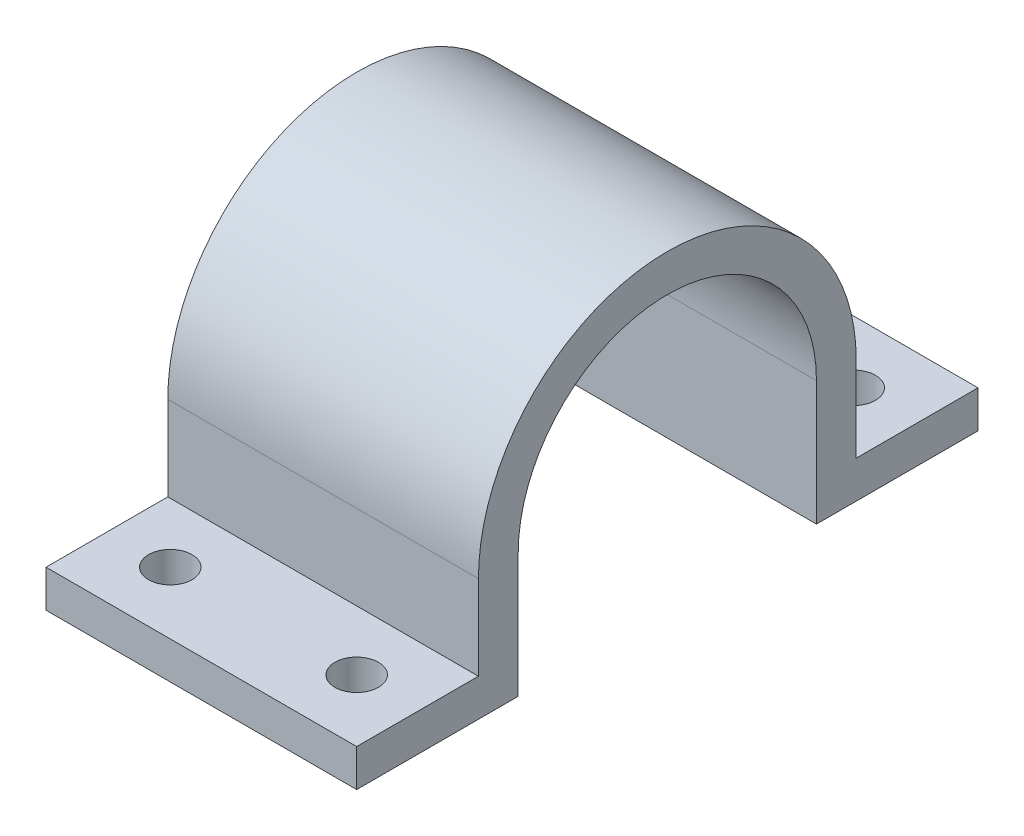
ISO-10303-21;
HEADER;
FILE_DESCRIPTION(('STEP AP214'),'2;1');
FILE_NAME('part.step','',(''),(''),'','','');
FILE_SCHEMA(('AUTOMOTIVE_DESIGN { 1 0 10303 214 1 1 1 1 }'));
ENDSEC;
DATA;
#1=APPLICATION_CONTEXT('core data for automotive mechanical design processes');
#2=APPLICATION_PROTOCOL_DEFINITION('international standard','automotive_design',2000,#1);
#3=PRODUCT_CONTEXT('',#1,'mechanical');
#4=PRODUCT('Part','Part','',(#3));
#5=PRODUCT_RELATED_PRODUCT_CATEGORY('part','',(#4));
#6=PRODUCT_DEFINITION_FORMATION('','',#4);
#7=PRODUCT_DEFINITION_CONTEXT('part definition',#1,'design');
#8=PRODUCT_DEFINITION('design','',#6,#7);
#9=PRODUCT_DEFINITION_SHAPE('','',#8);
#10=(LENGTH_UNIT() NAMED_UNIT(*) SI_UNIT(.MILLI.,.METRE.));
#11=(NAMED_UNIT(*) PLANE_ANGLE_UNIT() SI_UNIT($,.RADIAN.));
#12=(NAMED_UNIT(*) SI_UNIT($,.STERADIAN.) SOLID_ANGLE_UNIT());
#13=UNCERTAINTY_MEASURE_WITH_UNIT(LENGTH_MEASURE(1.E-05),#10,'distance_accuracy_value','');
#14=(GEOMETRIC_REPRESENTATION_CONTEXT(3) GLOBAL_UNCERTAINTY_ASSIGNED_CONTEXT((#13)) GLOBAL_UNIT_ASSIGNED_CONTEXT((#10,
#11,#12)) REPRESENTATION_CONTEXT('',''));
#15=CARTESIAN_POINT('',(0.,0.,0.));
#16=DIRECTION('',(0.,0.,1.));
#17=DIRECTION('',(1.,0.,0.));
#18=AXIS2_PLACEMENT_3D('',#15,#16,#17);
#19=CARTESIAN_POINT('',(25.,0.,-25.));
#20=DIRECTION('',(0.,1.,0.));
#21=DIRECTION('',(0.,0.,1.));
#22=AXIS2_PLACEMENT_3D('',#19,#20,#21);
#23=PLANE('',#22);
#24=CARTESIAN_POINT('',(20.,0.,20.));
#25=DIRECTION('',(0.,1.,0.));
#26=DIRECTION('',(0.,0.,1.));
#27=AXIS2_PLACEMENT_3D('',#24,#25,#26);
#28=CIRCLE('',#27,1.75);
#29=CARTESIAN_POINT('',(20.,0.,21.75));
#30=VERTEX_POINT('',#29);
#31=EDGE_CURVE('E285',#30,#30,#28,.T.);
#32=ORIENTED_EDGE('',*,*,#31,.T.);
#33=EDGE_LOOP('',(#32));
#34=FACE_BOUND('',#33,.T.);
#35=CARTESIAN_POINT('',(5.,0.,20.));
#36=DIRECTION('',(0.,1.,0.));
#37=DIRECTION('',(0.,0.,1.));
#38=AXIS2_PLACEMENT_3D('',#35,#36,#37);
#39=CIRCLE('',#38,1.75);
#40=CARTESIAN_POINT('',(5.,0.,21.75));
#41=VERTEX_POINT('',#40);
#42=EDGE_CURVE('E260',#41,#41,#39,.T.);
#43=ORIENTED_EDGE('',*,*,#42,.T.);
#44=EDGE_LOOP('',(#43));
#45=FACE_BOUND('',#44,.T.);
#46=DIRECTION('',(0.,0.,-1.));
#47=VECTOR('',#46,1.);
#48=CARTESIAN_POINT('',(0.,0.,-25.));
#49=LINE('',#48,#47);
#50=CARTESIAN_POINT('',(0.,0.,25.));
#51=VERTEX_POINT('',#50);
#52=CARTESIAN_POINT('',(0.,0.,12.));
#53=VERTEX_POINT('',#52);
#54=EDGE_CURVE('E158',#51,#53,#49,.T.);
#55=ORIENTED_EDGE('',*,*,#54,.T.);
#56=DIRECTION('',(1.,0.,0.));
#57=VECTOR('',#56,1.);
#58=CARTESIAN_POINT('',(0.,0.,12.));
#59=LINE('',#58,#57);
#60=CARTESIAN_POINT('',(25.,0.,12.));
#61=VERTEX_POINT('',#60);
#62=EDGE_CURVE('E243',#53,#61,#59,.T.);
#63=ORIENTED_EDGE('',*,*,#62,.T.);
#64=DIRECTION('',(0.,0.,-1.));
#65=VECTOR('',#64,1.);
#66=CARTESIAN_POINT('',(25.,0.,-25.));
#67=LINE('',#66,#65);
#68=CARTESIAN_POINT('',(25.,0.,25.));
#69=VERTEX_POINT('',#68);
#70=EDGE_CURVE('E228',#69,#61,#67,.T.);
#71=ORIENTED_EDGE('',*,*,#70,.F.);
#72=DIRECTION('',(-1.,0.,0.));
#73=VECTOR('',#72,1.);
#74=CARTESIAN_POINT('',(25.,0.,25.));
#75=LINE('',#74,#73);
#76=EDGE_CURVE('E154',#69,#51,#75,.T.);
#77=ORIENTED_EDGE('',*,*,#76,.T.);
#78=EDGE_LOOP('',(#55,#63,#71,#77));
#79=FACE_BOUND('',#78,.T.);
#80=ADVANCED_FACE('F43',(#34,#45,#79),#23,.F.);
#81=CARTESIAN_POINT('',(5.,0.,-20.));
#82=DIRECTION('',(0.,1.,0.));
#83=DIRECTION('',(0.,0.,1.));
#84=AXIS2_PLACEMENT_3D('',#81,#82,#83);
#85=CIRCLE('',#84,1.75);
#86=CARTESIAN_POINT('',(5.,0.,-18.25));
#87=VERTEX_POINT('',#86);
#88=EDGE_CURVE('E276',#87,#87,#85,.T.);
#89=ORIENTED_EDGE('',*,*,#88,.T.);
#90=EDGE_LOOP('',(#89));
#91=FACE_BOUND('',#90,.T.);
#92=CARTESIAN_POINT('',(20.,0.,-20.));
#93=DIRECTION('',(0.,1.,0.));
#94=DIRECTION('',(0.,0.,1.));
#95=AXIS2_PLACEMENT_3D('',#92,#93,#94);
#96=CIRCLE('',#95,1.75);
#97=CARTESIAN_POINT('',(20.,0.,-18.25));
#98=VERTEX_POINT('',#97);
#99=EDGE_CURVE('E292',#98,#98,#96,.T.);
#100=ORIENTED_EDGE('',*,*,#99,.T.);
#101=EDGE_LOOP('',(#100));
#102=FACE_BOUND('',#101,.T.);
#103=CARTESIAN_POINT('',(25.,0.,-12.));
#104=VERTEX_POINT('',#103);
#105=CARTESIAN_POINT('',(25.,0.,-25.));
#106=VERTEX_POINT('',#105);
#107=EDGE_CURVE('E109',#104,#106,#67,.T.);
#108=ORIENTED_EDGE('',*,*,#107,.F.);
#109=DIRECTION('',(1.,0.,0.));
#110=VECTOR('',#109,1.);
#111=CARTESIAN_POINT('',(0.,0.,-12.));
#112=LINE('',#111,#110);
#113=CARTESIAN_POINT('',(0.,0.,-12.));
#114=VERTEX_POINT('',#113);
#115=EDGE_CURVE('E231',#114,#104,#112,.T.);
#116=ORIENTED_EDGE('',*,*,#115,.F.);
#117=CARTESIAN_POINT('',(0.,0.,-25.));
#118=VERTEX_POINT('',#117);
#119=EDGE_CURVE('E163',#114,#118,#49,.T.);
#120=ORIENTED_EDGE('',*,*,#119,.T.);
#121=DIRECTION('',(-1.,0.,0.));
#122=VECTOR('',#121,1.);
#123=CARTESIAN_POINT('',(25.,0.,-25.));
#124=LINE('',#123,#122);
#125=EDGE_CURVE('E11',#106,#118,#124,.T.);
#126=ORIENTED_EDGE('',*,*,#125,.F.);
#127=EDGE_LOOP('',(#108,#116,#120,#126));
#128=FACE_BOUND('',#127,.T.);
#129=ADVANCED_FACE('F45',(#91,#102,#128),#23,.F.);
#130=CARTESIAN_POINT('',(25.,3.,-25.));
#131=DIRECTION('',(0.,0.,1.));
#132=DIRECTION('',(1.,0.,0.));
#133=AXIS2_PLACEMENT_3D('',#130,#131,#132);
#134=PLANE('',#133);
#135=DIRECTION('',(0.,1.,0.));
#136=VECTOR('',#135,1.);
#137=CARTESIAN_POINT('',(0.,3.,-25.));
#138=LINE('',#137,#136);
#139=CARTESIAN_POINT('',(0.,3.,-25.));
#140=VERTEX_POINT('',#139);
#141=EDGE_CURVE('E162',#118,#140,#138,.T.);
#142=ORIENTED_EDGE('',*,*,#141,.T.);
#143=DIRECTION('',(-1.,0.,0.));
#144=VECTOR('',#143,1.);
#145=CARTESIAN_POINT('',(25.,3.,-25.));
#146=LINE('',#145,#144);
#147=CARTESIAN_POINT('',(25.,3.,-25.));
#148=VERTEX_POINT('',#147);
#149=EDGE_CURVE('E52',#148,#140,#146,.T.);
#150=ORIENTED_EDGE('',*,*,#149,.F.);
#151=DIRECTION('',(0.,1.,0.));
#152=VECTOR('',#151,1.);
#153=CARTESIAN_POINT('',(25.,3.,-25.));
#154=LINE('',#153,#152);
#155=EDGE_CURVE('E225',#106,#148,#154,.T.);
#156=ORIENTED_EDGE('',*,*,#155,.F.);
#157=ORIENTED_EDGE('',*,*,#125,.T.);
#158=EDGE_LOOP('',(#142,#150,#156,#157));
#159=FACE_BOUND('',#158,.T.);
#160=ADVANCED_FACE('F303',(#159),#134,.F.);
#161=CARTESIAN_POINT('',(25.,3.,-15.2));
#162=DIRECTION('',(0.,-1.,0.));
#163=DIRECTION('',(0.,0.,-1.));
#164=AXIS2_PLACEMENT_3D('',#161,#162,#163);
#165=PLANE('',#164);
#166=CARTESIAN_POINT('',(5.,3.,-20.));
#167=DIRECTION('',(0.,1.,0.));
#168=DIRECTION('',(0.,0.,1.));
#169=AXIS2_PLACEMENT_3D('',#166,#167,#168);
#170=CIRCLE('',#169,1.75);
#171=CARTESIAN_POINT('',(5.,3.,-18.25));
#172=VERTEX_POINT('',#171);
#173=EDGE_CURVE('E280',#172,#172,#170,.T.);
#174=ORIENTED_EDGE('',*,*,#173,.F.);
#175=EDGE_LOOP('',(#174));
#176=FACE_BOUND('',#175,.T.);
#177=CARTESIAN_POINT('',(20.,3.,-20.));
#178=DIRECTION('',(0.,1.,0.));
#179=DIRECTION('',(0.,0.,1.));
#180=AXIS2_PLACEMENT_3D('',#177,#178,#179);
#181=CIRCLE('',#180,1.75);
#182=CARTESIAN_POINT('',(20.,3.,-18.25));
#183=VERTEX_POINT('',#182);
#184=EDGE_CURVE('E281',#183,#183,#181,.T.);
#185=ORIENTED_EDGE('',*,*,#184,.F.);
#186=EDGE_LOOP('',(#185));
#187=FACE_BOUND('',#186,.T.);
#188=DIRECTION('',(0.,0.,1.));
#189=VECTOR('',#188,1.);
#190=CARTESIAN_POINT('',(0.,3.,-15.2));
#191=LINE('',#190,#189);
#192=CARTESIAN_POINT('',(0.,3.,-15.2));
#193=VERTEX_POINT('',#192);
#194=EDGE_CURVE('E166',#140,#193,#191,.T.);
#195=ORIENTED_EDGE('',*,*,#194,.T.);
#196=DIRECTION('',(-1.,0.,0.));
#197=VECTOR('',#196,1.);
#198=CARTESIAN_POINT('',(25.,3.,-15.2));
#199=LINE('',#198,#197);
#200=CARTESIAN_POINT('',(25.,3.,-15.2));
#201=VERTEX_POINT('',#200);
#202=EDGE_CURVE('E192',#201,#193,#199,.T.);
#203=ORIENTED_EDGE('',*,*,#202,.F.);
#204=DIRECTION('',(0.,0.,1.));
#205=VECTOR('',#204,1.);
#206=CARTESIAN_POINT('',(25.,3.,-15.2));
#207=LINE('',#206,#205);
#208=EDGE_CURVE('E203',#148,#201,#207,.T.);
#209=ORIENTED_EDGE('',*,*,#208,.F.);
#210=ORIENTED_EDGE('',*,*,#149,.T.);
#211=EDGE_LOOP('',(#195,#203,#209,#210));
#212=FACE_BOUND('',#211,.T.);
#213=ADVANCED_FACE('F201',(#176,#187,#212),#165,.F.);
#214=CARTESIAN_POINT('',(25.,9.8,-15.2));
#215=DIRECTION('',(0.,0.,1.));
#216=DIRECTION('',(0.,-1.,0.));
#217=AXIS2_PLACEMENT_3D('',#214,#215,#216);
#218=PLANE('',#217);
#219=DIRECTION('',(0.,1.,0.));
#220=VECTOR('',#219,1.);
#221=CARTESIAN_POINT('',(0.,9.8,-15.2));
#222=LINE('',#221,#220);
#223=CARTESIAN_POINT('',(0.,9.8,-15.2));
#224=VERTEX_POINT('',#223);
#225=EDGE_CURVE('E169',#193,#224,#222,.T.);
#226=ORIENTED_EDGE('',*,*,#225,.T.);
#227=DIRECTION('',(-1.,0.,0.));
#228=VECTOR('',#227,1.);
#229=CARTESIAN_POINT('',(25.,9.8,-15.2));
#230=LINE('',#229,#228);
#231=CARTESIAN_POINT('',(25.,9.8,-15.2));
#232=VERTEX_POINT('',#231);
#233=EDGE_CURVE('E188',#232,#224,#230,.T.);
#234=ORIENTED_EDGE('',*,*,#233,.F.);
#235=DIRECTION('',(0.,1.,0.));
#236=VECTOR('',#235,1.);
#237=CARTESIAN_POINT('',(25.,9.8,-15.2));
#238=LINE('',#237,#236);
#239=EDGE_CURVE('E219',#201,#232,#238,.T.);
#240=ORIENTED_EDGE('',*,*,#239,.F.);
#241=ORIENTED_EDGE('',*,*,#202,.T.);
#242=EDGE_LOOP('',(#226,#234,#240,#241));
#243=FACE_BOUND('',#242,.T.);
#244=ADVANCED_FACE('F214',(#243),#218,.F.);
#245=CARTESIAN_POINT('',(25.,9.8,0.));
#246=DIRECTION('',(-1.,0.,0.));
#247=DIRECTION('',(0.,0.,1.));
#248=AXIS2_PLACEMENT_3D('',#245,#246,#247);
#249=CYLINDRICAL_SURFACE('',#248,15.2);
#250=CARTESIAN_POINT('',(0.,9.8,0.));
#251=DIRECTION('',(1.,0.,0.));
#252=DIRECTION('',(0.,0.,1.));
#253=AXIS2_PLACEMENT_3D('',#250,#251,#252);
#254=CIRCLE('',#253,15.2);
#255=CARTESIAN_POINT('',(0.,9.8,15.2));
#256=VERTEX_POINT('',#255);
#257=EDGE_CURVE('E172',#224,#256,#254,.T.);
#258=ORIENTED_EDGE('',*,*,#257,.T.);
#259=DIRECTION('',(-1.,0.,0.));
#260=VECTOR('',#259,1.);
#261=CARTESIAN_POINT('',(25.,9.8,15.2));
#262=LINE('',#261,#260);
#263=CARTESIAN_POINT('',(25.,9.8,15.2));
#264=VERTEX_POINT('',#263);
#265=EDGE_CURVE('E147',#264,#256,#262,.T.);
#266=ORIENTED_EDGE('',*,*,#265,.F.);
#267=CARTESIAN_POINT('',(25.,9.8,0.));
#268=DIRECTION('',(1.,0.,0.));
#269=DIRECTION('',(0.,0.,1.));
#270=AXIS2_PLACEMENT_3D('',#267,#268,#269);
#271=CIRCLE('',#270,15.2);
#272=EDGE_CURVE('E133',#232,#264,#271,.T.);
#273=ORIENTED_EDGE('',*,*,#272,.F.);
#274=ORIENTED_EDGE('',*,*,#233,.T.);
#275=EDGE_LOOP('',(#258,#266,#273,#274));
#276=FACE_BOUND('',#275,.T.);
#277=ADVANCED_FACE('F217',(#276),#249,.T.);
#278=CARTESIAN_POINT('',(25.,9.8,15.2));
#279=DIRECTION('',(0.,0.,-1.));
#280=DIRECTION('',(0.,1.,0.));
#281=AXIS2_PLACEMENT_3D('',#278,#279,#280);
#282=PLANE('',#281);
#283=DIRECTION('',(0.,-1.,0.));
#284=VECTOR('',#283,1.);
#285=CARTESIAN_POINT('',(0.,9.8,15.2));
#286=LINE('',#285,#284);
#287=CARTESIAN_POINT('',(0.,3.,15.2));
#288=VERTEX_POINT('',#287);
#289=EDGE_CURVE('E143',#256,#288,#286,.T.);
#290=ORIENTED_EDGE('',*,*,#289,.T.);
#291=DIRECTION('',(-1.,0.,0.));
#292=VECTOR('',#291,1.);
#293=CARTESIAN_POINT('',(25.,3.,15.2));
#294=LINE('',#293,#292);
#295=CARTESIAN_POINT('',(25.,3.,15.2));
#296=VERTEX_POINT('',#295);
#297=EDGE_CURVE('E140',#296,#288,#294,.T.);
#298=ORIENTED_EDGE('',*,*,#297,.F.);
#299=DIRECTION('',(0.,-1.,0.));
#300=VECTOR('',#299,1.);
#301=CARTESIAN_POINT('',(25.,9.8,15.2));
#302=LINE('',#301,#300);
#303=EDGE_CURVE('E126',#264,#296,#302,.T.);
#304=ORIENTED_EDGE('',*,*,#303,.F.);
#305=ORIENTED_EDGE('',*,*,#265,.T.);
#306=EDGE_LOOP('',(#290,#298,#304,#305));
#307=FACE_BOUND('',#306,.T.);
#308=ADVANCED_FACE('F141',(#307),#282,.F.);
#309=CARTESIAN_POINT('',(25.,3.,25.));
#310=DIRECTION('',(0.,-1.,0.));
#311=DIRECTION('',(0.,0.,-1.));
#312=AXIS2_PLACEMENT_3D('',#309,#310,#311);
#313=PLANE('',#312);
#314=CARTESIAN_POINT('',(20.,3.,20.));
#315=DIRECTION('',(0.,1.,0.));
#316=DIRECTION('',(0.,0.,1.));
#317=AXIS2_PLACEMENT_3D('',#314,#315,#316);
#318=CIRCLE('',#317,1.75);
#319=CARTESIAN_POINT('',(20.,3.,21.75));
#320=VERTEX_POINT('',#319);
#321=EDGE_CURVE('E272',#320,#320,#318,.T.);
#322=ORIENTED_EDGE('',*,*,#321,.F.);
#323=EDGE_LOOP('',(#322));
#324=FACE_BOUND('',#323,.T.);
#325=CARTESIAN_POINT('',(5.,3.,20.));
#326=DIRECTION('',(0.,1.,0.));
#327=DIRECTION('',(0.,0.,1.));
#328=AXIS2_PLACEMENT_3D('',#325,#326,#327);
#329=CIRCLE('',#328,1.75);
#330=CARTESIAN_POINT('',(5.,3.,21.75));
#331=VERTEX_POINT('',#330);
#332=EDGE_CURVE('E268',#331,#331,#329,.T.);
#333=ORIENTED_EDGE('',*,*,#332,.F.);
#334=EDGE_LOOP('',(#333));
#335=FACE_BOUND('',#334,.T.);
#336=DIRECTION('',(0.,0.,1.));
#337=VECTOR('',#336,1.);
#338=CARTESIAN_POINT('',(0.,3.,25.));
#339=LINE('',#338,#337);
#340=CARTESIAN_POINT('',(0.,3.,25.));
#341=VERTEX_POINT('',#340);
#342=EDGE_CURVE('E177',#288,#341,#339,.T.);
#343=ORIENTED_EDGE('',*,*,#342,.T.);
#344=DIRECTION('',(-1.,0.,0.));
#345=VECTOR('',#344,1.);
#346=CARTESIAN_POINT('',(25.,3.,25.));
#347=LINE('',#346,#345);
#348=CARTESIAN_POINT('',(25.,3.,25.));
#349=VERTEX_POINT('',#348);
#350=EDGE_CURVE('E148',#349,#341,#347,.T.);
#351=ORIENTED_EDGE('',*,*,#350,.F.);
#352=DIRECTION('',(0.,0.,1.));
#353=VECTOR('',#352,1.);
#354=CARTESIAN_POINT('',(25.,3.,25.));
#355=LINE('',#354,#353);
#356=EDGE_CURVE('E130',#296,#349,#355,.T.);
#357=ORIENTED_EDGE('',*,*,#356,.F.);
#358=ORIENTED_EDGE('',*,*,#297,.T.);
#359=EDGE_LOOP('',(#343,#351,#357,#358));
#360=FACE_BOUND('',#359,.T.);
#361=ADVANCED_FACE('F150',(#324,#335,#360),#313,.F.);
#362=CARTESIAN_POINT('',(25.,0.,25.));
#363=DIRECTION('',(0.,0.,-1.));
#364=DIRECTION('',(0.,1.,0.));
#365=AXIS2_PLACEMENT_3D('',#362,#363,#364);
#366=PLANE('',#365);
#367=DIRECTION('',(0.,-1.,0.));
#368=VECTOR('',#367,1.);
#369=CARTESIAN_POINT('',(0.,0.,25.));
#370=LINE('',#369,#368);
#371=EDGE_CURVE('E101',#341,#51,#370,.T.);
#372=ORIENTED_EDGE('',*,*,#371,.T.);
#373=ORIENTED_EDGE('',*,*,#76,.F.);
#374=DIRECTION('',(0.,-1.,0.));
#375=VECTOR('',#374,1.);
#376=CARTESIAN_POINT('',(25.,0.,25.));
#377=LINE('',#376,#375);
#378=EDGE_CURVE('E68',#349,#69,#377,.T.);
#379=ORIENTED_EDGE('',*,*,#378,.F.);
#380=ORIENTED_EDGE('',*,*,#350,.T.);
#381=EDGE_LOOP('',(#372,#373,#379,#380));
#382=FACE_BOUND('',#381,.T.);
#383=ADVANCED_FACE('F364',(#382),#366,.F.);
#384=CARTESIAN_POINT('',(25.,9.8,0.));
#385=DIRECTION('',(-1.,0.,0.));
#386=DIRECTION('',(0.,0.,1.));
#387=AXIS2_PLACEMENT_3D('',#384,#385,#386);
#388=PLANE('',#387);
#389=ORIENTED_EDGE('',*,*,#70,.T.);
#390=DIRECTION('',(0.,-1.,0.));
#391=VECTOR('',#390,1.);
#392=CARTESIAN_POINT('',(25.,10.,12.));
#393=LINE('',#392,#391);
#394=CARTESIAN_POINT('',(25.,10.,12.));
#395=VERTEX_POINT('',#394);
#396=EDGE_CURVE('E247',#395,#61,#393,.T.);
#397=ORIENTED_EDGE('',*,*,#396,.F.);
#398=CARTESIAN_POINT('',(25.,10.,0.));
#399=DIRECTION('',(1.,0.,0.));
#400=DIRECTION('',(0.,0.,1.));
#401=AXIS2_PLACEMENT_3D('',#398,#399,#400);
#402=CIRCLE('',#401,12.);
#403=CARTESIAN_POINT('',(25.,10.,-12.));
#404=VERTEX_POINT('',#403);
#405=EDGE_CURVE('E252',#404,#395,#402,.T.);
#406=ORIENTED_EDGE('',*,*,#405,.F.);
#407=DIRECTION('',(0.,1.,0.));
#408=VECTOR('',#407,1.);
#409=CARTESIAN_POINT('',(25.,10.,-12.));
#410=LINE('',#409,#408);
#411=EDGE_CURVE('E256',#104,#404,#410,.T.);
#412=ORIENTED_EDGE('',*,*,#411,.F.);
#413=ORIENTED_EDGE('',*,*,#107,.T.);
#414=ORIENTED_EDGE('',*,*,#155,.T.);
#415=ORIENTED_EDGE('',*,*,#208,.T.);
#416=ORIENTED_EDGE('',*,*,#239,.T.);
#417=ORIENTED_EDGE('',*,*,#272,.T.);
#418=ORIENTED_EDGE('',*,*,#303,.T.);
#419=ORIENTED_EDGE('',*,*,#356,.T.);
#420=ORIENTED_EDGE('',*,*,#378,.T.);
#421=EDGE_LOOP('',(#389,#397,#406,#412,#413,#414,#415,#416,#417,#418,#419,#420));
#422=FACE_BOUND('',#421,.T.);
#423=ADVANCED_FACE('F128',(#422),#388,.F.);
#424=CARTESIAN_POINT('',(0.,9.8,0.));
#425=DIRECTION('',(-1.,0.,0.));
#426=DIRECTION('',(0.,0.,1.));
#427=AXIS2_PLACEMENT_3D('',#424,#425,#426);
#428=PLANE('',#427);
#429=DIRECTION('',(0.,-1.,0.));
#430=VECTOR('',#429,1.);
#431=CARTESIAN_POINT('',(0.,10.,12.));
#432=LINE('',#431,#430);
#433=CARTESIAN_POINT('',(0.,10.,12.));
#434=VERTEX_POINT('',#433);
#435=EDGE_CURVE('E236',#434,#53,#432,.T.);
#436=ORIENTED_EDGE('',*,*,#435,.T.);
#437=ORIENTED_EDGE('',*,*,#54,.F.);
#438=ORIENTED_EDGE('',*,*,#371,.F.);
#439=ORIENTED_EDGE('',*,*,#342,.F.);
#440=ORIENTED_EDGE('',*,*,#289,.F.);
#441=ORIENTED_EDGE('',*,*,#257,.F.);
#442=ORIENTED_EDGE('',*,*,#225,.F.);
#443=ORIENTED_EDGE('',*,*,#194,.F.);
#444=ORIENTED_EDGE('',*,*,#141,.F.);
#445=ORIENTED_EDGE('',*,*,#119,.F.);
#446=DIRECTION('',(0.,1.,0.));
#447=VECTOR('',#446,1.);
#448=CARTESIAN_POINT('',(0.,10.,-12.));
#449=LINE('',#448,#447);
#450=CARTESIAN_POINT('',(0.,10.,-12.));
#451=VERTEX_POINT('',#450);
#452=EDGE_CURVE('E251',#114,#451,#449,.T.);
#453=ORIENTED_EDGE('',*,*,#452,.T.);
#454=CARTESIAN_POINT('',(0.,10.,0.));
#455=DIRECTION('',(1.,0.,0.));
#456=DIRECTION('',(0.,0.,1.));
#457=AXIS2_PLACEMENT_3D('',#454,#455,#456);
#458=CIRCLE('',#457,12.);
#459=EDGE_CURVE('E59',#451,#434,#458,.T.);
#460=ORIENTED_EDGE('',*,*,#459,.T.);
#461=EDGE_LOOP('',(#436,#437,#438,#439,#440,#441,#442,#443,#444,#445,#453,#460));
#462=FACE_BOUND('',#461,.T.);
#463=ADVANCED_FACE('F209',(#462),#428,.T.);
#464=CARTESIAN_POINT('',(0.,10.,12.));
#465=DIRECTION('',(0.,0.,1.));
#466=DIRECTION('',(0.,-1.,0.));
#467=AXIS2_PLACEMENT_3D('',#464,#465,#466);
#468=PLANE('',#467);
#469=ORIENTED_EDGE('',*,*,#396,.T.);
#470=ORIENTED_EDGE('',*,*,#62,.F.);
#471=ORIENTED_EDGE('',*,*,#435,.F.);
#472=DIRECTION('',(1.,0.,0.));
#473=VECTOR('',#472,1.);
#474=CARTESIAN_POINT('',(0.,10.,12.));
#475=LINE('',#474,#473);
#476=EDGE_CURVE('E239',#434,#395,#475,.T.);
#477=ORIENTED_EDGE('',*,*,#476,.T.);
#478=EDGE_LOOP('',(#469,#470,#471,#477));
#479=FACE_BOUND('',#478,.T.);
#480=ADVANCED_FACE('F329',(#479),#468,.F.);
#481=CARTESIAN_POINT('',(0.,10.,0.));
#482=DIRECTION('',(1.,0.,0.));
#483=DIRECTION('',(0.,0.,-1.));
#484=AXIS2_PLACEMENT_3D('',#481,#482,#483);
#485=CYLINDRICAL_SURFACE('',#484,12.);
#486=ORIENTED_EDGE('',*,*,#405,.T.);
#487=ORIENTED_EDGE('',*,*,#476,.F.);
#488=ORIENTED_EDGE('',*,*,#459,.F.);
#489=DIRECTION('',(1.,0.,0.));
#490=VECTOR('',#489,1.);
#491=CARTESIAN_POINT('',(0.,10.,-12.));
#492=LINE('',#491,#490);
#493=EDGE_CURVE('E235',#451,#404,#492,.T.);
#494=ORIENTED_EDGE('',*,*,#493,.T.);
#495=EDGE_LOOP('',(#486,#487,#488,#494));
#496=FACE_BOUND('',#495,.T.);
#497=ADVANCED_FACE('F341',(#496),#485,.F.);
#498=CARTESIAN_POINT('',(0.,10.,-12.));
#499=DIRECTION('',(0.,0.,-1.));
#500=DIRECTION('',(0.,1.,0.));
#501=AXIS2_PLACEMENT_3D('',#498,#499,#500);
#502=PLANE('',#501);
#503=ORIENTED_EDGE('',*,*,#411,.T.);
#504=ORIENTED_EDGE('',*,*,#493,.F.);
#505=ORIENTED_EDGE('',*,*,#452,.F.);
#506=ORIENTED_EDGE('',*,*,#115,.T.);
#507=EDGE_LOOP('',(#503,#504,#505,#506));
#508=FACE_BOUND('',#507,.T.);
#509=ADVANCED_FACE('F343',(#508),#502,.F.);
#510=CARTESIAN_POINT('',(5.,0.,20.));
#511=DIRECTION('',(0.,1.,0.));
#512=DIRECTION('',(0.,0.,1.));
#513=AXIS2_PLACEMENT_3D('',#510,#511,#512);
#514=CYLINDRICAL_SURFACE('',#513,1.75);
#515=ORIENTED_EDGE('',*,*,#42,.F.);
#516=EDGE_LOOP('',(#515));
#517=FACE_BOUND('',#516,.T.);
#518=ORIENTED_EDGE('',*,*,#332,.T.);
#519=EDGE_LOOP('',(#518));
#520=FACE_BOUND('',#519,.T.);
#521=ADVANCED_FACE('F350',(#517,#520),#514,.F.);
#522=CARTESIAN_POINT('',(20.,0.,20.));
#523=DIRECTION('',(0.,1.,0.));
#524=DIRECTION('',(0.,0.,1.));
#525=AXIS2_PLACEMENT_3D('',#522,#523,#524);
#526=CYLINDRICAL_SURFACE('',#525,1.75);
#527=ORIENTED_EDGE('',*,*,#31,.F.);
#528=EDGE_LOOP('',(#527));
#529=FACE_BOUND('',#528,.T.);
#530=ORIENTED_EDGE('',*,*,#321,.T.);
#531=EDGE_LOOP('',(#530));
#532=FACE_BOUND('',#531,.T.);
#533=ADVANCED_FACE('F356',(#529,#532),#526,.F.);
#534=CARTESIAN_POINT('',(20.,0.,-20.));
#535=DIRECTION('',(0.,1.,0.));
#536=DIRECTION('',(0.,0.,1.));
#537=AXIS2_PLACEMENT_3D('',#534,#535,#536);
#538=CYLINDRICAL_SURFACE('',#537,1.75);
#539=ORIENTED_EDGE('',*,*,#99,.F.);
#540=EDGE_LOOP('',(#539));
#541=FACE_BOUND('',#540,.T.);
#542=ORIENTED_EDGE('',*,*,#184,.T.);
#543=EDGE_LOOP('',(#542));
#544=FACE_BOUND('',#543,.T.);
#545=ADVANCED_FACE('F300',(#541,#544),#538,.F.);
#546=CARTESIAN_POINT('',(5.,0.,-20.));
#547=DIRECTION('',(0.,1.,0.));
#548=DIRECTION('',(0.,0.,1.));
#549=AXIS2_PLACEMENT_3D('',#546,#547,#548);
#550=CYLINDRICAL_SURFACE('',#549,1.75);
#551=ORIENTED_EDGE('',*,*,#88,.F.);
#552=EDGE_LOOP('',(#551));
#553=FACE_BOUND('',#552,.T.);
#554=ORIENTED_EDGE('',*,*,#173,.T.);
#555=EDGE_LOOP('',(#554));
#556=FACE_BOUND('',#555,.T.);
#557=ADVANCED_FACE('F498',(#553,#556),#550,.F.);
#558=CLOSED_SHELL('',(#80,#129,#160,#213,#244,#277,#308,#361,#383,#423,#463,#480,#497,#509,#521,
#533,#545,#557));
#559=MANIFOLD_SOLID_BREP('B2',#558);
#560=ADVANCED_BREP_SHAPE_REPRESENTATION('',(#18,#559),#14);
#561=SHAPE_DEFINITION_REPRESENTATION(#9,#560);
ENDSEC;
END-ISO-10303-21;
